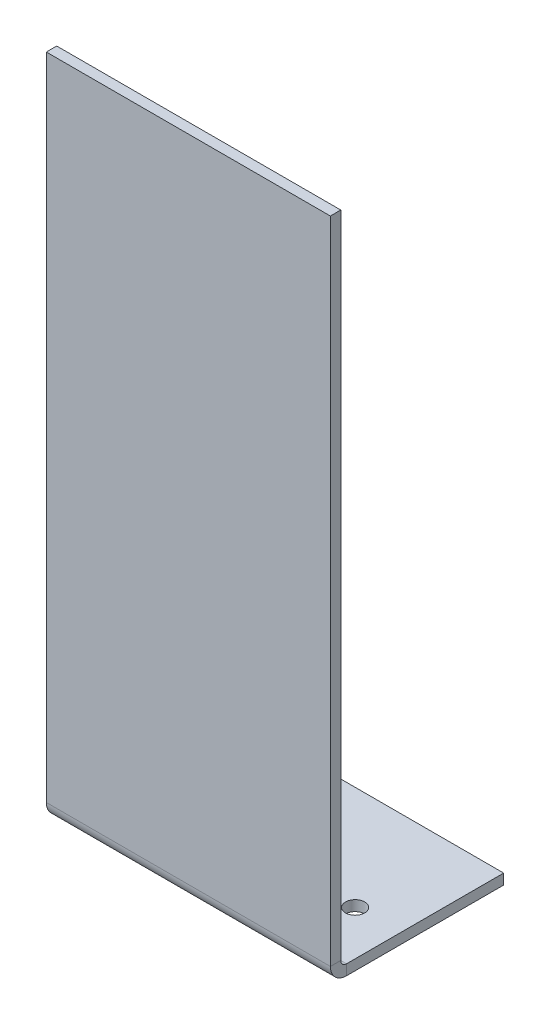
ISO-10303-21;
HEADER;
FILE_DESCRIPTION(('STEP AP214'),'2;1');
FILE_NAME('part.step','',(''),(''),'','','');
FILE_SCHEMA(('AUTOMOTIVE_DESIGN { 1 0 10303 214 1 1 1 1 }'));
ENDSEC;
DATA;
#1=APPLICATION_CONTEXT('core data for automotive mechanical design processes');
#2=APPLICATION_PROTOCOL_DEFINITION('international standard','automotive_design',2000,#1);
#3=PRODUCT_CONTEXT('',#1,'mechanical');
#4=PRODUCT('Part','Part','',(#3));
#5=PRODUCT_RELATED_PRODUCT_CATEGORY('part','',(#4));
#6=PRODUCT_DEFINITION_FORMATION('','',#4);
#7=PRODUCT_DEFINITION_CONTEXT('part definition',#1,'design');
#8=PRODUCT_DEFINITION('design','',#6,#7);
#9=PRODUCT_DEFINITION_SHAPE('','',#8);
#10=(LENGTH_UNIT() NAMED_UNIT(*) SI_UNIT(.MILLI.,.METRE.));
#11=(NAMED_UNIT(*) PLANE_ANGLE_UNIT() SI_UNIT($,.RADIAN.));
#12=(NAMED_UNIT(*) SI_UNIT($,.STERADIAN.) SOLID_ANGLE_UNIT());
#13=UNCERTAINTY_MEASURE_WITH_UNIT(LENGTH_MEASURE(1.E-05),#10,'distance_accuracy_value','');
#14=(GEOMETRIC_REPRESENTATION_CONTEXT(3) GLOBAL_UNCERTAINTY_ASSIGNED_CONTEXT((#13)) GLOBAL_UNIT_ASSIGNED_CONTEXT((#10,
#11,#12)) REPRESENTATION_CONTEXT('',''));
#15=CARTESIAN_POINT('',(0.,0.,0.));
#16=DIRECTION('',(0.,0.,1.));
#17=DIRECTION('',(1.,0.,0.));
#18=AXIS2_PLACEMENT_3D('',#15,#16,#17);
#19=CARTESIAN_POINT('',(0.,-25.7370725065091,26.6631274934909));
#20=DIRECTION('',(-1.,0.,0.));
#21=DIRECTION('',(0.,1.,0.));
#22=AXIS2_PLACEMENT_3D('',#19,#20,#21);
#23=PLANE('',#22);
#24=DIRECTION('',(0.,1.,0.));
#25=VECTOR('',#24,1.);
#26=CARTESIAN_POINT('',(0.,-25.7370725065091,25.0629274934909));
#27=LINE('',#26,#25);
#28=CARTESIAN_POINT('',(0.,0.889000000000004,25.0629274934909));
#29=VERTEX_POINT('',#28);
#30=CARTESIAN_POINT('',(0.,100.862927493491,25.0629274934905));
#31=VERTEX_POINT('',#30);
#32=EDGE_CURVE('E71',#29,#31,#27,.T.);
#33=ORIENTED_EDGE('',*,*,#32,.F.);
#34=DIRECTION('',(0.,0.,1.));
#35=VECTOR('',#34,1.);
#36=CARTESIAN_POINT('',(0.,0.889000000000011,26.6631274934909));
#37=LINE('',#36,#35);
#38=CARTESIAN_POINT('',(0.,0.889000000000011,26.6631274934909));
#39=VERTEX_POINT('',#38);
#40=EDGE_CURVE('E112',#29,#39,#37,.T.);
#41=ORIENTED_EDGE('',*,*,#40,.T.);
#42=DIRECTION('',(0.,1.,0.));
#43=VECTOR('',#42,1.);
#44=CARTESIAN_POINT('',(0.,-25.7370725065091,26.6631274934909));
#45=LINE('',#44,#43);
#46=CARTESIAN_POINT('',(0.,100.862927493491,26.6631274934905));
#47=VERTEX_POINT('',#46);
#48=EDGE_CURVE('E51',#39,#47,#45,.T.);
#49=ORIENTED_EDGE('',*,*,#48,.T.);
#50=DIRECTION('',(0.,0.,-1.));
#51=VECTOR('',#50,1.);
#52=CARTESIAN_POINT('',(0.,100.862927493491,26.6631274934905));
#53=LINE('',#52,#51);
#54=EDGE_CURVE('E197',#47,#31,#53,.T.);
#55=ORIENTED_EDGE('',*,*,#54,.T.);
#56=EDGE_LOOP('',(#33,#41,#49,#55));
#57=FACE_BOUND('',#56,.T.);
#58=ADVANCED_FACE('F47',(#57),#23,.T.);
#59=CARTESIAN_POINT('',(43.69375,-25.7370725065091,26.6631274934909));
#60=DIRECTION('',(1.,0.,0.));
#61=DIRECTION('',(0.,-1.,0.));
#62=AXIS2_PLACEMENT_3D('',#59,#60,#61);
#63=PLANE('',#62);
#64=DIRECTION('',(0.,-1.,0.));
#65=VECTOR('',#64,1.);
#66=CARTESIAN_POINT('',(43.69375,-25.7370725065091,26.6631274934909));
#67=LINE('',#66,#65);
#68=CARTESIAN_POINT('',(43.69375,100.862927493491,26.6631274934905));
#69=VERTEX_POINT('',#68);
#70=CARTESIAN_POINT('',(43.69375,0.889000000000015,26.6631274934908));
#71=VERTEX_POINT('',#70);
#72=EDGE_CURVE('E193',#69,#71,#67,.T.);
#73=ORIENTED_EDGE('',*,*,#72,.T.);
#74=DIRECTION('',(0.,0.,-1.));
#75=VECTOR('',#74,1.);
#76=CARTESIAN_POINT('',(43.69375,0.889000000000011,26.6631274934908));
#77=LINE('',#76,#75);
#78=CARTESIAN_POINT('',(43.69375,0.889000000000004,25.0629274934908));
#79=VERTEX_POINT('',#78);
#80=EDGE_CURVE('E12',#71,#79,#77,.T.);
#81=ORIENTED_EDGE('',*,*,#80,.T.);
#82=DIRECTION('',(0.,-1.,0.));
#83=VECTOR('',#82,1.);
#84=CARTESIAN_POINT('',(43.69375,-25.7370725065091,25.0629274934909));
#85=LINE('',#84,#83);
#86=CARTESIAN_POINT('',(43.69375,100.862927493491,25.0629274934905));
#87=VERTEX_POINT('',#86);
#88=EDGE_CURVE('E64',#87,#79,#85,.T.);
#89=ORIENTED_EDGE('',*,*,#88,.F.);
#90=DIRECTION('',(0.,0.,-1.));
#91=VECTOR('',#90,1.);
#92=CARTESIAN_POINT('',(43.69375,100.862927493491,26.6631274934905));
#93=LINE('',#92,#91);
#94=EDGE_CURVE('E137',#69,#87,#93,.T.);
#95=ORIENTED_EDGE('',*,*,#94,.F.);
#96=EDGE_LOOP('',(#73,#81,#89,#95));
#97=FACE_BOUND('',#96,.T.);
#98=ADVANCED_FACE('F49',(#97),#63,.T.);
#99=CARTESIAN_POINT('',(0.,-25.7370725065091,25.0629274934909));
#100=DIRECTION('',(0.,0.,-1.));
#101=DIRECTION('',(0.,1.,0.));
#102=AXIS2_PLACEMENT_3D('',#99,#100,#101);
#103=PLANE('',#102);
#104=ORIENTED_EDGE('',*,*,#88,.T.);
#105=DIRECTION('',(-1.,0.,0.));
#106=VECTOR('',#105,1.);
#107=CARTESIAN_POINT('',(0.,0.889000000000004,25.0629274934909));
#108=LINE('',#107,#106);
#109=EDGE_CURVE('E56',#79,#29,#108,.T.);
#110=ORIENTED_EDGE('',*,*,#109,.T.);
#111=ORIENTED_EDGE('',*,*,#32,.T.);
#112=DIRECTION('',(1.,0.,0.));
#113=VECTOR('',#112,1.);
#114=CARTESIAN_POINT('',(0.,100.862927493491,25.0629274934905));
#115=LINE('',#114,#113);
#116=EDGE_CURVE('E194',#31,#87,#115,.T.);
#117=ORIENTED_EDGE('',*,*,#116,.T.);
#118=EDGE_LOOP('',(#104,#110,#111,#117));
#119=FACE_BOUND('',#118,.T.);
#120=ADVANCED_FACE('F201',(#119),#103,.T.);
#121=CARTESIAN_POINT('',(0.,100.862927493491,26.6631274934905));
#122=DIRECTION('',(0.,1.,0.));
#123=DIRECTION('',(1.,0.,0.));
#124=AXIS2_PLACEMENT_3D('',#121,#122,#123);
#125=PLANE('',#124);
#126=ORIENTED_EDGE('',*,*,#116,.F.);
#127=ORIENTED_EDGE('',*,*,#54,.F.);
#128=DIRECTION('',(1.,0.,0.));
#129=VECTOR('',#128,1.);
#130=CARTESIAN_POINT('',(0.,100.862927493491,26.6631274934905));
#131=LINE('',#130,#129);
#132=EDGE_CURVE('E128',#47,#69,#131,.T.);
#133=ORIENTED_EDGE('',*,*,#132,.T.);
#134=ORIENTED_EDGE('',*,*,#94,.T.);
#135=EDGE_LOOP('',(#126,#127,#133,#134));
#136=FACE_BOUND('',#135,.T.);
#137=ADVANCED_FACE('F205',(#136),#125,.T.);
#138=CARTESIAN_POINT('',(0.,-25.7370725065091,26.6631274934909));
#139=DIRECTION('',(0.,0.,-1.));
#140=DIRECTION('',(0.,1.,0.));
#141=AXIS2_PLACEMENT_3D('',#138,#139,#140);
#142=PLANE('',#141);
#143=DIRECTION('',(-1.,0.,0.));
#144=VECTOR('',#143,1.);
#145=CARTESIAN_POINT('',(0.,0.889000000000011,26.6631274934909));
#146=LINE('',#145,#144);
#147=EDGE_CURVE('E119',#71,#39,#146,.T.);
#148=ORIENTED_EDGE('',*,*,#147,.F.);
#149=ORIENTED_EDGE('',*,*,#72,.F.);
#150=ORIENTED_EDGE('',*,*,#132,.F.);
#151=ORIENTED_EDGE('',*,*,#48,.F.);
#152=EDGE_LOOP('',(#148,#149,#150,#151));
#153=FACE_BOUND('',#152,.T.);
#154=ADVANCED_FACE('F124',(#153),#142,.F.);
#155=CARTESIAN_POINT('',(0.,-1.6002,0.));
#156=DIRECTION('',(0.,0.,-1.));
#157=DIRECTION('',(-1.,0.,0.));
#158=AXIS2_PLACEMENT_3D('',#155,#156,#157);
#159=PLANE('',#158);
#160=DIRECTION('',(-1.,0.,0.));
#161=VECTOR('',#160,1.);
#162=CARTESIAN_POINT('',(0.,0.,0.));
#163=LINE('',#162,#161);
#164=CARTESIAN_POINT('',(43.69375,0.,0.));
#165=VERTEX_POINT('',#164);
#166=CARTESIAN_POINT('',(0.,0.,0.));
#167=VERTEX_POINT('',#166);
#168=EDGE_CURVE('E162',#165,#167,#163,.T.);
#169=ORIENTED_EDGE('',*,*,#168,.F.);
#170=DIRECTION('',(0.,1.,0.));
#171=VECTOR('',#170,1.);
#172=CARTESIAN_POINT('',(43.69375,-1.6002,0.));
#173=LINE('',#172,#171);
#174=CARTESIAN_POINT('',(43.69375,-1.6002,0.));
#175=VERTEX_POINT('',#174);
#176=EDGE_CURVE('E155',#175,#165,#173,.T.);
#177=ORIENTED_EDGE('',*,*,#176,.F.);
#178=DIRECTION('',(-1.,0.,0.));
#179=VECTOR('',#178,1.);
#180=CARTESIAN_POINT('',(0.,-1.6002,0.));
#181=LINE('',#180,#179);
#182=CARTESIAN_POINT('',(0.,-1.6002,0.));
#183=VERTEX_POINT('',#182);
#184=EDGE_CURVE('E186',#175,#183,#181,.T.);
#185=ORIENTED_EDGE('',*,*,#184,.T.);
#186=DIRECTION('',(0.,1.,0.));
#187=VECTOR('',#186,1.);
#188=CARTESIAN_POINT('',(0.,-1.6002,0.));
#189=LINE('',#188,#187);
#190=EDGE_CURVE('E184',#183,#167,#189,.T.);
#191=ORIENTED_EDGE('',*,*,#190,.T.);
#192=EDGE_LOOP('',(#169,#177,#185,#191));
#193=FACE_BOUND('',#192,.T.);
#194=ADVANCED_FACE('F230',(#193),#159,.T.);
#195=CARTESIAN_POINT('',(6.846875,-1.6002,16.01));
#196=DIRECTION('',(0.,1.,0.));
#197=DIRECTION('',(0.,0.,1.));
#198=AXIS2_PLACEMENT_3D('',#195,#196,#197);
#199=CYLINDRICAL_SURFACE('',#198,1.4732);
#200=CARTESIAN_POINT('',(6.846875,-1.6002,16.01));
#201=DIRECTION('',(0.,1.,0.));
#202=DIRECTION('',(0.,0.,1.));
#203=AXIS2_PLACEMENT_3D('',#200,#201,#202);
#204=CIRCLE('',#203,1.4732);
#205=CARTESIAN_POINT('',(6.846875,-1.6002,17.4832));
#206=VERTEX_POINT('',#205);
#207=EDGE_CURVE('E172',#206,#206,#204,.T.);
#208=ORIENTED_EDGE('',*,*,#207,.F.);
#209=EDGE_LOOP('',(#208));
#210=FACE_BOUND('',#209,.T.);
#211=CARTESIAN_POINT('',(6.846875,0.,16.01));
#212=DIRECTION('',(0.,1.,0.));
#213=DIRECTION('',(0.,0.,1.));
#214=AXIS2_PLACEMENT_3D('',#211,#212,#213);
#215=CIRCLE('',#214,1.4732);
#216=CARTESIAN_POINT('',(6.846875,0.,17.4832));
#217=VERTEX_POINT('',#216);
#218=EDGE_CURVE('E181',#217,#217,#215,.T.);
#219=ORIENTED_EDGE('',*,*,#218,.T.);
#220=EDGE_LOOP('',(#219));
#221=FACE_BOUND('',#220,.T.);
#222=ADVANCED_FACE('F232',(#210,#221),#199,.F.);
#223=CARTESIAN_POINT('',(36.846875,-1.6002,16.01));
#224=DIRECTION('',(0.,1.,0.));
#225=DIRECTION('',(0.,0.,1.));
#226=AXIS2_PLACEMENT_3D('',#223,#224,#225);
#227=CYLINDRICAL_SURFACE('',#226,1.4732);
#228=CARTESIAN_POINT('',(36.846875,-1.6002,16.01));
#229=DIRECTION('',(0.,1.,0.));
#230=DIRECTION('',(0.,0.,1.));
#231=AXIS2_PLACEMENT_3D('',#228,#229,#230);
#232=CIRCLE('',#231,1.4732);
#233=CARTESIAN_POINT('',(36.846875,-1.6002,17.4832));
#234=VERTEX_POINT('',#233);
#235=EDGE_CURVE('E175',#234,#234,#232,.T.);
#236=ORIENTED_EDGE('',*,*,#235,.F.);
#237=EDGE_LOOP('',(#236));
#238=FACE_BOUND('',#237,.T.);
#239=CARTESIAN_POINT('',(36.846875,0.,16.01));
#240=DIRECTION('',(0.,1.,0.));
#241=DIRECTION('',(0.,0.,1.));
#242=AXIS2_PLACEMENT_3D('',#239,#240,#241);
#243=CIRCLE('',#242,1.4732);
#244=CARTESIAN_POINT('',(36.846875,0.,17.4832));
#245=VERTEX_POINT('',#244);
#246=EDGE_CURVE('E178',#245,#245,#243,.T.);
#247=ORIENTED_EDGE('',*,*,#246,.T.);
#248=EDGE_LOOP('',(#247));
#249=FACE_BOUND('',#248,.T.);
#250=ADVANCED_FACE('F238',(#238,#249),#227,.F.);
#251=CARTESIAN_POINT('',(0.,-1.6002,0.));
#252=DIRECTION('',(0.,1.,0.));
#253=DIRECTION('',(0.,0.,1.));
#254=AXIS2_PLACEMENT_3D('',#251,#252,#253);
#255=PLANE('',#254);
#256=ORIENTED_EDGE('',*,*,#235,.T.);
#257=EDGE_LOOP('',(#256));
#258=FACE_BOUND('',#257,.T.);
#259=ORIENTED_EDGE('',*,*,#207,.T.);
#260=EDGE_LOOP('',(#259));
#261=FACE_BOUND('',#260,.T.);
#262=DIRECTION('',(0.,0.,-1.));
#263=VECTOR('',#262,1.);
#264=CARTESIAN_POINT('',(43.69375,-1.6002,0.));
#265=LINE('',#264,#263);
#266=CARTESIAN_POINT('',(43.69375,-1.6002,24.1739274934909));
#267=VERTEX_POINT('',#266);
#268=EDGE_CURVE('E158',#267,#175,#265,.T.);
#269=ORIENTED_EDGE('',*,*,#268,.F.);
#270=DIRECTION('',(-1.,0.,0.));
#271=VECTOR('',#270,1.);
#272=CARTESIAN_POINT('',(0.,-1.6002,24.1739274934909));
#273=LINE('',#272,#271);
#274=CARTESIAN_POINT('',(0.,-1.6002,24.1739274934909));
#275=VERTEX_POINT('',#274);
#276=EDGE_CURVE('E169',#267,#275,#273,.T.);
#277=ORIENTED_EDGE('',*,*,#276,.T.);
#278=DIRECTION('',(0.,0.,1.));
#279=VECTOR('',#278,1.);
#280=CARTESIAN_POINT('',(0.,-1.6002,0.));
#281=LINE('',#280,#279);
#282=EDGE_CURVE('E167',#183,#275,#281,.T.);
#283=ORIENTED_EDGE('',*,*,#282,.F.);
#284=ORIENTED_EDGE('',*,*,#184,.F.);
#285=EDGE_LOOP('',(#269,#277,#283,#284));
#286=FACE_BOUND('',#285,.T.);
#287=ADVANCED_FACE('F228',(#258,#261,#286),#255,.F.);
#288=CARTESIAN_POINT('',(0.,-1.6002,0.));
#289=DIRECTION('',(-1.,0.,0.));
#290=DIRECTION('',(0.,0.,1.));
#291=AXIS2_PLACEMENT_3D('',#288,#289,#290);
#292=PLANE('',#291);
#293=DIRECTION('',(0.,-1.,0.));
#294=VECTOR('',#293,1.);
#295=CARTESIAN_POINT('',(0.,-1.6002,24.1739274934909));
#296=LINE('',#295,#294);
#297=CARTESIAN_POINT('',(0.,0.,24.1739274934909));
#298=VERTEX_POINT('',#297);
#299=EDGE_CURVE('E142',#298,#275,#296,.T.);
#300=ORIENTED_EDGE('',*,*,#299,.F.);
#301=DIRECTION('',(0.,0.,1.));
#302=VECTOR('',#301,1.);
#303=CARTESIAN_POINT('',(0.,0.,0.));
#304=LINE('',#303,#302);
#305=EDGE_CURVE('E160',#167,#298,#304,.T.);
#306=ORIENTED_EDGE('',*,*,#305,.F.);
#307=ORIENTED_EDGE('',*,*,#190,.F.);
#308=ORIENTED_EDGE('',*,*,#282,.T.);
#309=EDGE_LOOP('',(#300,#306,#307,#308));
#310=FACE_BOUND('',#309,.T.);
#311=ADVANCED_FACE('F224',(#310),#292,.T.);
#312=CARTESIAN_POINT('',(0.,0.,0.));
#313=DIRECTION('',(0.,1.,0.));
#314=DIRECTION('',(0.,0.,1.));
#315=AXIS2_PLACEMENT_3D('',#312,#313,#314);
#316=PLANE('',#315);
#317=DIRECTION('',(-1.,0.,0.));
#318=VECTOR('',#317,1.);
#319=CARTESIAN_POINT('',(0.,0.,24.1739274934909));
#320=LINE('',#319,#318);
#321=CARTESIAN_POINT('',(43.69375,0.,24.1739274934909));
#322=VERTEX_POINT('',#321);
#323=EDGE_CURVE('E146',#322,#298,#320,.T.);
#324=ORIENTED_EDGE('',*,*,#323,.F.);
#325=DIRECTION('',(0.,0.,-1.));
#326=VECTOR('',#325,1.);
#327=CARTESIAN_POINT('',(43.69375,0.,0.));
#328=LINE('',#327,#326);
#329=EDGE_CURVE('E165',#322,#165,#328,.T.);
#330=ORIENTED_EDGE('',*,*,#329,.T.);
#331=ORIENTED_EDGE('',*,*,#168,.T.);
#332=ORIENTED_EDGE('',*,*,#305,.T.);
#333=EDGE_LOOP('',(#324,#330,#331,#332));
#334=FACE_BOUND('',#333,.T.);
#335=ORIENTED_EDGE('',*,*,#246,.F.);
#336=EDGE_LOOP('',(#335));
#337=FACE_BOUND('',#336,.T.);
#338=ORIENTED_EDGE('',*,*,#218,.F.);
#339=EDGE_LOOP('',(#338));
#340=FACE_BOUND('',#339,.T.);
#341=ADVANCED_FACE('F220',(#334,#337,#340),#316,.T.);
#342=CARTESIAN_POINT('',(43.69375,-1.6002,0.));
#343=DIRECTION('',(1.,0.,0.));
#344=DIRECTION('',(0.,0.,-1.));
#345=AXIS2_PLACEMENT_3D('',#342,#343,#344);
#346=PLANE('',#345);
#347=DIRECTION('',(0.,1.,0.));
#348=VECTOR('',#347,1.);
#349=CARTESIAN_POINT('',(43.69375,-1.6002,24.1739274934908));
#350=LINE('',#349,#348);
#351=EDGE_CURVE('E143',#267,#322,#350,.T.);
#352=ORIENTED_EDGE('',*,*,#351,.F.);
#353=ORIENTED_EDGE('',*,*,#268,.T.);
#354=ORIENTED_EDGE('',*,*,#176,.T.);
#355=ORIENTED_EDGE('',*,*,#329,.F.);
#356=EDGE_LOOP('',(#352,#353,#354,#355));
#357=FACE_BOUND('',#356,.T.);
#358=ADVANCED_FACE('F215',(#357),#346,.T.);
#359=CARTESIAN_POINT('',(43.69375,0.889,24.1739274934908));
#360=DIRECTION('',(1.,0.,0.));
#361=DIRECTION('',(0.,0.,-1.));
#362=AXIS2_PLACEMENT_3D('',#359,#360,#361);
#363=PLANE('',#362);
#364=ORIENTED_EDGE('',*,*,#351,.T.);
#365=CARTESIAN_POINT('',(43.69375,0.889,24.1739274934908));
#366=DIRECTION('',(-1.,0.,0.));
#367=DIRECTION('',(0.,0.,1.));
#368=AXIS2_PLACEMENT_3D('',#365,#366,#367);
#369=CIRCLE('',#368,0.889);
#370=EDGE_CURVE('E152',#322,#79,#369,.T.);
#371=ORIENTED_EDGE('',*,*,#370,.T.);
#372=ORIENTED_EDGE('',*,*,#80,.F.);
#373=CARTESIAN_POINT('',(43.69375,0.889,24.1739274934908));
#374=DIRECTION('',(-1.,0.,0.));
#375=DIRECTION('',(0.,0.,-1.));
#376=AXIS2_PLACEMENT_3D('',#373,#374,#375);
#377=CIRCLE('',#376,2.4892);
#378=EDGE_CURVE('E136',#267,#71,#377,.T.);
#379=ORIENTED_EDGE('',*,*,#378,.F.);
#380=EDGE_LOOP('',(#364,#371,#372,#379));
#381=FACE_BOUND('',#380,.T.);
#382=ADVANCED_FACE('F212',(#381),#363,.T.);
#383=CARTESIAN_POINT('',(0.,0.889,24.1739274934909));
#384=DIRECTION('',(-1.,0.,0.));
#385=DIRECTION('',(0.,0.,1.));
#386=AXIS2_PLACEMENT_3D('',#383,#384,#385);
#387=PLANE('',#386);
#388=ORIENTED_EDGE('',*,*,#40,.F.);
#389=CARTESIAN_POINT('',(0.,0.889,24.1739274934909));
#390=DIRECTION('',(-1.,0.,0.));
#391=DIRECTION('',(0.,0.,1.));
#392=AXIS2_PLACEMENT_3D('',#389,#390,#391);
#393=CIRCLE('',#392,0.889);
#394=EDGE_CURVE('E148',#29,#298,#393,.F.);
#395=ORIENTED_EDGE('',*,*,#394,.T.);
#396=ORIENTED_EDGE('',*,*,#299,.T.);
#397=CARTESIAN_POINT('',(0.,0.889,24.1739274934909));
#398=DIRECTION('',(1.,0.,0.));
#399=DIRECTION('',(0.,0.,1.));
#400=AXIS2_PLACEMENT_3D('',#397,#398,#399);
#401=CIRCLE('',#400,2.4892);
#402=EDGE_CURVE('E134',#39,#275,#401,.T.);
#403=ORIENTED_EDGE('',*,*,#402,.F.);
#404=EDGE_LOOP('',(#388,#395,#396,#403));
#405=FACE_BOUND('',#404,.T.);
#406=ADVANCED_FACE('F140',(#405),#387,.T.);
#407=CARTESIAN_POINT('',(65.6386258700825,0.889,24.1739274934908));
#408=DIRECTION('',(-1.,0.,0.));
#409=DIRECTION('',(0.,0.,1.));
#410=AXIS2_PLACEMENT_3D('',#407,#408,#409);
#411=CYLINDRICAL_SURFACE('',#410,2.4892);
#412=ORIENTED_EDGE('',*,*,#402,.T.);
#413=ORIENTED_EDGE('',*,*,#276,.F.);
#414=ORIENTED_EDGE('',*,*,#378,.T.);
#415=ORIENTED_EDGE('',*,*,#147,.T.);
#416=EDGE_LOOP('',(#412,#413,#414,#415));
#417=FACE_BOUND('',#416,.T.);
#418=ADVANCED_FACE('F132',(#417),#411,.T.);
#419=CARTESIAN_POINT('',(65.6386258700825,0.889,24.1739274934908));
#420=DIRECTION('',(-1.,0.,0.));
#421=DIRECTION('',(0.,0.,1.));
#422=AXIS2_PLACEMENT_3D('',#419,#420,#421);
#423=CYLINDRICAL_SURFACE('',#422,0.889);
#424=ORIENTED_EDGE('',*,*,#394,.F.);
#425=ORIENTED_EDGE('',*,*,#109,.F.);
#426=ORIENTED_EDGE('',*,*,#370,.F.);
#427=ORIENTED_EDGE('',*,*,#323,.T.);
#428=EDGE_LOOP('',(#424,#425,#426,#427));
#429=FACE_BOUND('',#428,.T.);
#430=ADVANCED_FACE('F211',(#429),#423,.F.);
#431=CLOSED_SHELL('',(#58,#98,#120,#137,#154,#194,#222,#250,#287,#311,#341,#358,#382,#406,#418,#430));
#432=MANIFOLD_SOLID_BREP('B2',#431);
#433=ADVANCED_BREP_SHAPE_REPRESENTATION('',(#18,#432),#14);
#434=SHAPE_DEFINITION_REPRESENTATION(#9,#433);
ENDSEC;
END-ISO-10303-21;
